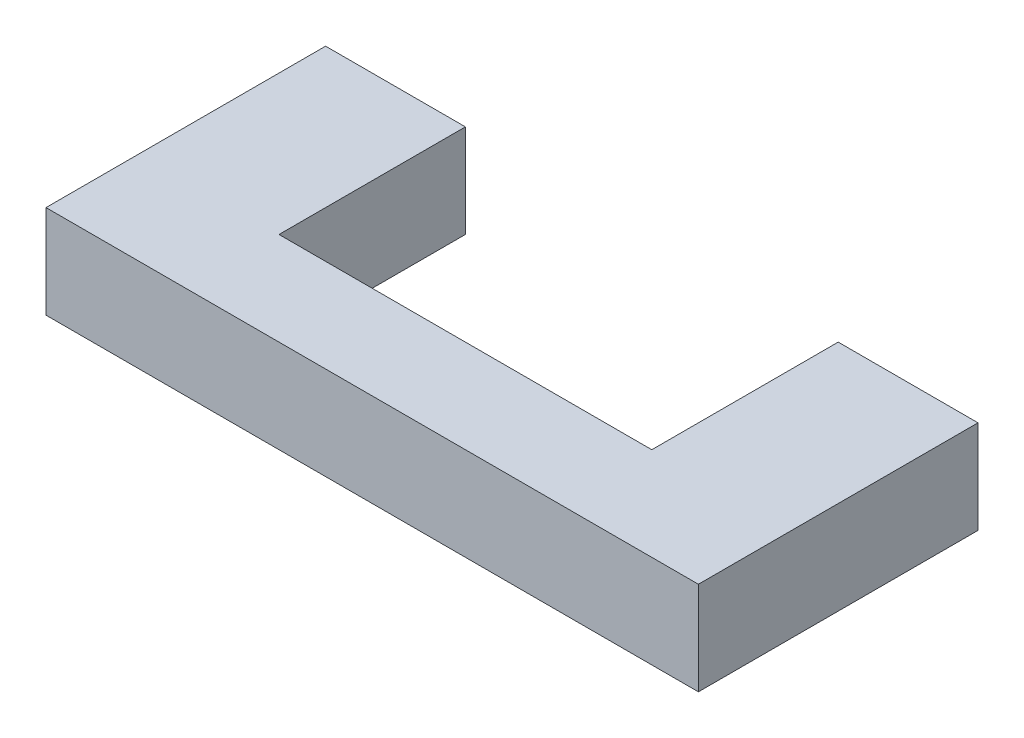
ISO-10303-21;
HEADER;
FILE_DESCRIPTION(('STEP AP214'),'2;1');
FILE_NAME('part.step','',(''),(''),'','','');
FILE_SCHEMA(('AUTOMOTIVE_DESIGN { 1 0 10303 214 1 1 1 1 }'));
ENDSEC;
DATA;
#1=APPLICATION_CONTEXT('core data for automotive mechanical design processes');
#2=APPLICATION_PROTOCOL_DEFINITION('international standard','automotive_design',2000,#1);
#3=PRODUCT_CONTEXT('',#1,'mechanical');
#4=PRODUCT('Part','Part','',(#3));
#5=PRODUCT_RELATED_PRODUCT_CATEGORY('part','',(#4));
#6=PRODUCT_DEFINITION_FORMATION('','',#4);
#7=PRODUCT_DEFINITION_CONTEXT('part definition',#1,'design');
#8=PRODUCT_DEFINITION('design','',#6,#7);
#9=PRODUCT_DEFINITION_SHAPE('','',#8);
#10=(LENGTH_UNIT() NAMED_UNIT(*) SI_UNIT(.MILLI.,.METRE.));
#11=(NAMED_UNIT(*) PLANE_ANGLE_UNIT() SI_UNIT($,.RADIAN.));
#12=(NAMED_UNIT(*) SI_UNIT($,.STERADIAN.) SOLID_ANGLE_UNIT());
#13=UNCERTAINTY_MEASURE_WITH_UNIT(LENGTH_MEASURE(1.E-05),#10,'distance_accuracy_value','');
#14=(GEOMETRIC_REPRESENTATION_CONTEXT(3) GLOBAL_UNCERTAINTY_ASSIGNED_CONTEXT((#13)) GLOBAL_UNIT_ASSIGNED_CONTEXT((#10,
#11,#12)) REPRESENTATION_CONTEXT('',''));
#15=CARTESIAN_POINT('',(0.,0.,0.));
#16=DIRECTION('',(0.,0.,1.));
#17=DIRECTION('',(1.,0.,0.));
#18=AXIS2_PLACEMENT_3D('',#15,#16,#17);
#19=CARTESIAN_POINT('',(-22.225,6.35,-9.525));
#20=DIRECTION('',(0.,0.,1.));
#21=DIRECTION('',(1.,0.,0.));
#22=AXIS2_PLACEMENT_3D('',#19,#20,#21);
#23=PLANE('',#22);
#24=DIRECTION('',(-1.,0.,0.));
#25=VECTOR('',#24,1.);
#26=CARTESIAN_POINT('',(-22.225,6.35,-9.525));
#27=LINE('',#26,#25);
#28=CARTESIAN_POINT('',(-12.7,6.35,-9.525));
#29=VERTEX_POINT('',#28);
#30=CARTESIAN_POINT('',(-22.225,6.35,-9.525));
#31=VERTEX_POINT('',#30);
#32=EDGE_CURVE('E124',#29,#31,#27,.T.);
#33=ORIENTED_EDGE('',*,*,#32,.F.);
#34=DIRECTION('',(0.,1.,0.));
#35=VECTOR('',#34,1.);
#36=CARTESIAN_POINT('',(-12.7,-28.3980633142473,-9.525));
#37=LINE('',#36,#35);
#38=CARTESIAN_POINT('',(-12.7,0.,-9.525));
#39=VERTEX_POINT('',#38);
#40=EDGE_CURVE('E112',#39,#29,#37,.T.);
#41=ORIENTED_EDGE('',*,*,#40,.F.);
#42=DIRECTION('',(-1.,0.,0.));
#43=VECTOR('',#42,1.);
#44=CARTESIAN_POINT('',(-22.225,0.,-9.525));
#45=LINE('',#44,#43);
#46=CARTESIAN_POINT('',(-22.225,0.,-9.525));
#47=VERTEX_POINT('',#46);
#48=EDGE_CURVE('E122',#39,#47,#45,.T.);
#49=ORIENTED_EDGE('',*,*,#48,.T.);
#50=DIRECTION('',(0.,-1.,0.));
#51=VECTOR('',#50,1.);
#52=CARTESIAN_POINT('',(-22.225,6.35,-9.525));
#53=LINE('',#52,#51);
#54=EDGE_CURVE('E42',#31,#47,#53,.T.);
#55=ORIENTED_EDGE('',*,*,#54,.F.);
#56=EDGE_LOOP('',(#33,#41,#49,#55));
#57=FACE_BOUND('',#56,.T.);
#58=ADVANCED_FACE('F34',(#57),#23,.F.);
#59=CARTESIAN_POINT('',(22.225,6.35,9.525));
#60=DIRECTION('',(-1.,0.,0.));
#61=DIRECTION('',(0.,0.,1.));
#62=AXIS2_PLACEMENT_3D('',#59,#60,#61);
#63=PLANE('',#62);
#64=DIRECTION('',(0.,0.,-1.));
#65=VECTOR('',#64,1.);
#66=CARTESIAN_POINT('',(22.225,0.,9.525));
#67=LINE('',#66,#65);
#68=CARTESIAN_POINT('',(22.225,0.,9.525));
#69=VERTEX_POINT('',#68);
#70=CARTESIAN_POINT('',(22.225,0.,-9.525));
#71=VERTEX_POINT('',#70);
#72=EDGE_CURVE('E131',#69,#71,#67,.T.);
#73=ORIENTED_EDGE('',*,*,#72,.T.);
#74=DIRECTION('',(0.,-1.,0.));
#75=VECTOR('',#74,1.);
#76=CARTESIAN_POINT('',(22.225,6.35,-9.525));
#77=LINE('',#76,#75);
#78=CARTESIAN_POINT('',(22.225,6.35,-9.525));
#79=VERTEX_POINT('',#78);
#80=EDGE_CURVE('E11',#79,#71,#77,.T.);
#81=ORIENTED_EDGE('',*,*,#80,.F.);
#82=DIRECTION('',(0.,0.,-1.));
#83=VECTOR('',#82,1.);
#84=CARTESIAN_POINT('',(22.225,6.35,9.525));
#85=LINE('',#84,#83);
#86=CARTESIAN_POINT('',(22.225,6.35,9.525));
#87=VERTEX_POINT('',#86);
#88=EDGE_CURVE('E140',#87,#79,#85,.T.);
#89=ORIENTED_EDGE('',*,*,#88,.F.);
#90=DIRECTION('',(0.,-1.,0.));
#91=VECTOR('',#90,1.);
#92=CARTESIAN_POINT('',(22.225,6.35,9.525));
#93=LINE('',#92,#91);
#94=EDGE_CURVE('E141',#87,#69,#93,.T.);
#95=ORIENTED_EDGE('',*,*,#94,.T.);
#96=EDGE_LOOP('',(#73,#81,#89,#95));
#97=FACE_BOUND('',#96,.T.);
#98=ADVANCED_FACE('F36',(#97),#63,.F.);
#99=CARTESIAN_POINT('',(12.7,0.,-9.525));
#100=VERTEX_POINT('',#99);
#101=EDGE_CURVE('E130',#71,#100,#45,.T.);
#102=ORIENTED_EDGE('',*,*,#101,.T.);
#103=DIRECTION('',(0.,1.,0.));
#104=VECTOR('',#103,1.);
#105=CARTESIAN_POINT('',(12.7,-28.3980633142473,-9.525));
#106=LINE('',#105,#104);
#107=CARTESIAN_POINT('',(12.7,6.35,-9.525));
#108=VERTEX_POINT('',#107);
#109=EDGE_CURVE('E49',#100,#108,#106,.T.);
#110=ORIENTED_EDGE('',*,*,#109,.T.);
#111=EDGE_CURVE('E85',#79,#108,#27,.T.);
#112=ORIENTED_EDGE('',*,*,#111,.F.);
#113=ORIENTED_EDGE('',*,*,#80,.T.);
#114=EDGE_LOOP('',(#102,#110,#112,#113));
#115=FACE_BOUND('',#114,.T.);
#116=ADVANCED_FACE('F173',(#115),#23,.F.);
#117=CARTESIAN_POINT('',(-22.225,6.35,9.525));
#118=DIRECTION('',(1.,0.,0.));
#119=DIRECTION('',(0.,0.,-1.));
#120=AXIS2_PLACEMENT_3D('',#117,#118,#119);
#121=PLANE('',#120);
#122=DIRECTION('',(0.,0.,1.));
#123=VECTOR('',#122,1.);
#124=CARTESIAN_POINT('',(-22.225,0.,9.525));
#125=LINE('',#124,#123);
#126=CARTESIAN_POINT('',(-22.225,0.,9.525));
#127=VERTEX_POINT('',#126);
#128=EDGE_CURVE('E129',#47,#127,#125,.T.);
#129=ORIENTED_EDGE('',*,*,#128,.T.);
#130=DIRECTION('',(0.,-1.,0.));
#131=VECTOR('',#130,1.);
#132=CARTESIAN_POINT('',(-22.225,6.35,9.525));
#133=LINE('',#132,#131);
#134=CARTESIAN_POINT('',(-22.225,6.35,9.525));
#135=VERTEX_POINT('',#134);
#136=EDGE_CURVE('E143',#135,#127,#133,.T.);
#137=ORIENTED_EDGE('',*,*,#136,.F.);
#138=DIRECTION('',(0.,0.,1.));
#139=VECTOR('',#138,1.);
#140=CARTESIAN_POINT('',(-22.225,6.35,9.525));
#141=LINE('',#140,#139);
#142=EDGE_CURVE('E148',#31,#135,#141,.T.);
#143=ORIENTED_EDGE('',*,*,#142,.F.);
#144=ORIENTED_EDGE('',*,*,#54,.T.);
#145=EDGE_LOOP('',(#129,#137,#143,#144));
#146=FACE_BOUND('',#145,.T.);
#147=ADVANCED_FACE('F146',(#146),#121,.F.);
#148=CARTESIAN_POINT('',(-22.225,6.35,9.525));
#149=DIRECTION('',(0.,0.,-1.));
#150=DIRECTION('',(-1.,0.,0.));
#151=AXIS2_PLACEMENT_3D('',#148,#149,#150);
#152=PLANE('',#151);
#153=DIRECTION('',(1.,0.,0.));
#154=VECTOR('',#153,1.);
#155=CARTESIAN_POINT('',(-22.225,0.,9.525));
#156=LINE('',#155,#154);
#157=EDGE_CURVE('E79',#127,#69,#156,.T.);
#158=ORIENTED_EDGE('',*,*,#157,.T.);
#159=ORIENTED_EDGE('',*,*,#94,.F.);
#160=DIRECTION('',(1.,0.,0.));
#161=VECTOR('',#160,1.);
#162=CARTESIAN_POINT('',(-22.225,6.35,9.525));
#163=LINE('',#162,#161);
#164=EDGE_CURVE('E58',#135,#87,#163,.T.);
#165=ORIENTED_EDGE('',*,*,#164,.F.);
#166=ORIENTED_EDGE('',*,*,#136,.T.);
#167=EDGE_LOOP('',(#158,#159,#165,#166));
#168=FACE_BOUND('',#167,.T.);
#169=ADVANCED_FACE('F178',(#168),#152,.F.);
#170=CARTESIAN_POINT('',(0.,6.35,0.));
#171=DIRECTION('',(0.,-1.,0.));
#172=DIRECTION('',(0.,0.,-1.));
#173=AXIS2_PLACEMENT_3D('',#170,#171,#172);
#174=PLANE('',#173);
#175=DIRECTION('',(1.,0.,0.));
#176=VECTOR('',#175,1.);
#177=CARTESIAN_POINT('',(12.7,6.35,3.175));
#178=LINE('',#177,#176);
#179=CARTESIAN_POINT('',(-12.7,6.35,3.17500000000001));
#180=VERTEX_POINT('',#179);
#181=CARTESIAN_POINT('',(12.7,6.35,3.175));
#182=VERTEX_POINT('',#181);
#183=EDGE_CURVE('E125',#180,#182,#178,.T.);
#184=ORIENTED_EDGE('',*,*,#183,.F.);
#185=DIRECTION('',(0.,0.,1.));
#186=VECTOR('',#185,1.);
#187=CARTESIAN_POINT('',(-12.7,6.35,-9.525));
#188=LINE('',#187,#186);
#189=EDGE_CURVE('E163',#29,#180,#188,.T.);
#190=ORIENTED_EDGE('',*,*,#189,.F.);
#191=ORIENTED_EDGE('',*,*,#32,.T.);
#192=ORIENTED_EDGE('',*,*,#142,.T.);
#193=ORIENTED_EDGE('',*,*,#164,.T.);
#194=ORIENTED_EDGE('',*,*,#88,.T.);
#195=ORIENTED_EDGE('',*,*,#111,.T.);
#196=DIRECTION('',(0.,0.,-1.));
#197=VECTOR('',#196,1.);
#198=CARTESIAN_POINT('',(12.7,6.35,-9.525));
#199=LINE('',#198,#197);
#200=EDGE_CURVE('E161',#182,#108,#199,.T.);
#201=ORIENTED_EDGE('',*,*,#200,.F.);
#202=EDGE_LOOP('',(#184,#190,#191,#192,#193,#194,#195,#201));
#203=FACE_BOUND('',#202,.T.);
#204=ADVANCED_FACE('F171',(#203),#174,.F.);
#205=CARTESIAN_POINT('',(0.,0.,0.));
#206=DIRECTION('',(0.,-1.,0.));
#207=DIRECTION('',(0.,0.,-1.));
#208=AXIS2_PLACEMENT_3D('',#205,#206,#207);
#209=PLANE('',#208);
#210=DIRECTION('',(0.,0.,1.));
#211=VECTOR('',#210,1.);
#212=CARTESIAN_POINT('',(-12.7,0.,-9.525));
#213=LINE('',#212,#211);
#214=CARTESIAN_POINT('',(-12.7,0.,3.17500000000001));
#215=VERTEX_POINT('',#214);
#216=EDGE_CURVE('E108',#39,#215,#213,.T.);
#217=ORIENTED_EDGE('',*,*,#216,.T.);
#218=DIRECTION('',(1.,0.,0.));
#219=VECTOR('',#218,1.);
#220=CARTESIAN_POINT('',(12.7,0.,3.175));
#221=LINE('',#220,#219);
#222=CARTESIAN_POINT('',(12.7,0.,3.175));
#223=VERTEX_POINT('',#222);
#224=EDGE_CURVE('E156',#215,#223,#221,.T.);
#225=ORIENTED_EDGE('',*,*,#224,.T.);
#226=DIRECTION('',(0.,0.,-1.));
#227=VECTOR('',#226,1.);
#228=CARTESIAN_POINT('',(12.7,0.,-9.525));
#229=LINE('',#228,#227);
#230=EDGE_CURVE('E153',#223,#100,#229,.T.);
#231=ORIENTED_EDGE('',*,*,#230,.T.);
#232=ORIENTED_EDGE('',*,*,#101,.F.);
#233=ORIENTED_EDGE('',*,*,#72,.F.);
#234=ORIENTED_EDGE('',*,*,#157,.F.);
#235=ORIENTED_EDGE('',*,*,#128,.F.);
#236=ORIENTED_EDGE('',*,*,#48,.F.);
#237=EDGE_LOOP('',(#217,#225,#231,#232,#233,#234,#235,#236));
#238=FACE_BOUND('',#237,.T.);
#239=ADVANCED_FACE('F128',(#238),#209,.T.);
#240=CARTESIAN_POINT('',(-12.7,-28.3980633142473,-9.525));
#241=DIRECTION('',(-1.,0.,0.));
#242=DIRECTION('',(0.,0.,1.));
#243=AXIS2_PLACEMENT_3D('',#240,#241,#242);
#244=PLANE('',#243);
#245=ORIENTED_EDGE('',*,*,#40,.T.);
#246=ORIENTED_EDGE('',*,*,#189,.T.);
#247=DIRECTION('',(0.,1.,0.));
#248=VECTOR('',#247,1.);
#249=CARTESIAN_POINT('',(-12.7,-28.3980633142473,3.17500000000001));
#250=LINE('',#249,#248);
#251=EDGE_CURVE('E114',#215,#180,#250,.T.);
#252=ORIENTED_EDGE('',*,*,#251,.F.);
#253=ORIENTED_EDGE('',*,*,#216,.F.);
#254=EDGE_LOOP('',(#245,#246,#252,#253));
#255=FACE_BOUND('',#254,.T.);
#256=ADVANCED_FACE('F110',(#255),#244,.F.);
#257=CARTESIAN_POINT('',(12.7,-28.3980633142473,3.175));
#258=DIRECTION('',(0.,0.,1.));
#259=DIRECTION('',(1.,0.,0.));
#260=AXIS2_PLACEMENT_3D('',#257,#258,#259);
#261=PLANE('',#260);
#262=ORIENTED_EDGE('',*,*,#251,.T.);
#263=ORIENTED_EDGE('',*,*,#183,.T.);
#264=DIRECTION('',(0.,1.,0.));
#265=VECTOR('',#264,1.);
#266=CARTESIAN_POINT('',(12.7,-28.3980633142473,3.175));
#267=LINE('',#266,#265);
#268=EDGE_CURVE('E157',#223,#182,#267,.T.);
#269=ORIENTED_EDGE('',*,*,#268,.F.);
#270=ORIENTED_EDGE('',*,*,#224,.F.);
#271=EDGE_LOOP('',(#262,#263,#269,#270));
#272=FACE_BOUND('',#271,.T.);
#273=ADVANCED_FACE('F170',(#272),#261,.F.);
#274=CARTESIAN_POINT('',(12.7,-28.3980633142473,-9.525));
#275=DIRECTION('',(1.,0.,0.));
#276=DIRECTION('',(0.,0.,-1.));
#277=AXIS2_PLACEMENT_3D('',#274,#275,#276);
#278=PLANE('',#277);
#279=ORIENTED_EDGE('',*,*,#268,.T.);
#280=ORIENTED_EDGE('',*,*,#200,.T.);
#281=ORIENTED_EDGE('',*,*,#109,.F.);
#282=ORIENTED_EDGE('',*,*,#230,.F.);
#283=EDGE_LOOP('',(#279,#280,#281,#282));
#284=FACE_BOUND('',#283,.T.);
#285=ADVANCED_FACE('F172',(#284),#278,.F.);
#286=CLOSED_SHELL('',(#58,#98,#116,#147,#169,#204,#239,#256,#273,#285));
#287=MANIFOLD_SOLID_BREP('B2',#286);
#288=ADVANCED_BREP_SHAPE_REPRESENTATION('',(#18,#287),#14);
#289=SHAPE_DEFINITION_REPRESENTATION(#9,#288);
ENDSEC;
END-ISO-10303-21;
